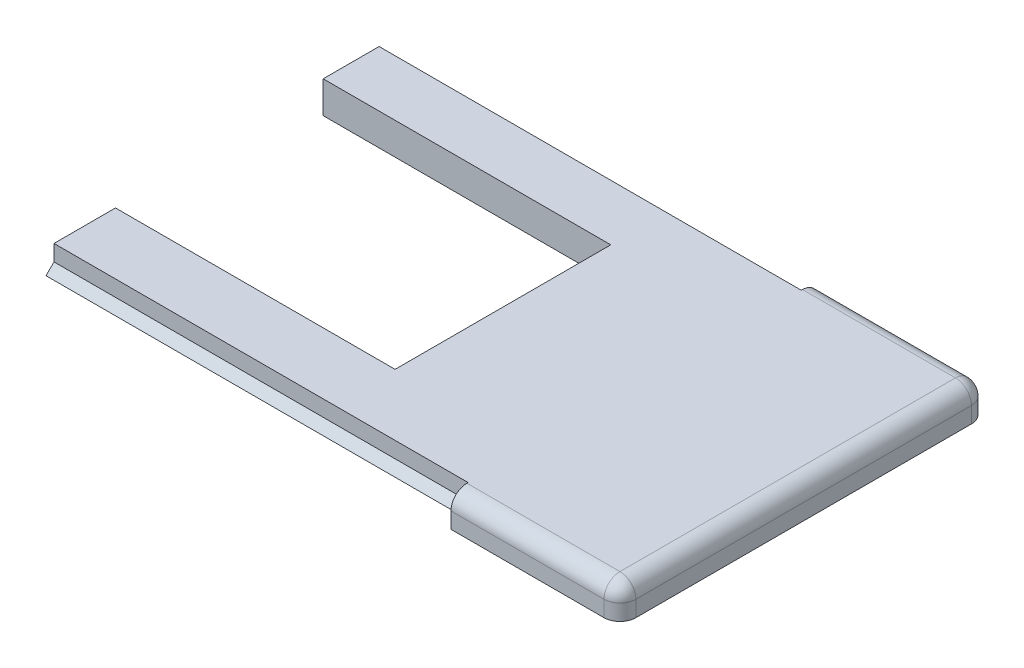
ISO-10303-21;
HEADER;
FILE_DESCRIPTION(('STEP AP214'),'2;1');
FILE_NAME('part.step','',(''),(''),'','','');
FILE_SCHEMA(('AUTOMOTIVE_DESIGN { 1 0 10303 214 1 1 1 1 }'));
ENDSEC;
DATA;
#1=APPLICATION_CONTEXT('core data for automotive mechanical design processes');
#2=APPLICATION_PROTOCOL_DEFINITION('international standard','automotive_design',2000,#1);
#3=PRODUCT_CONTEXT('',#1,'mechanical');
#4=PRODUCT('Part','Part','',(#3));
#5=PRODUCT_RELATED_PRODUCT_CATEGORY('part','',(#4));
#6=PRODUCT_DEFINITION_FORMATION('','',#4);
#7=PRODUCT_DEFINITION_CONTEXT('part definition',#1,'design');
#8=PRODUCT_DEFINITION('design','',#6,#7);
#9=PRODUCT_DEFINITION_SHAPE('','',#8);
#10=(LENGTH_UNIT() NAMED_UNIT(*) SI_UNIT(.MILLI.,.METRE.));
#11=(NAMED_UNIT(*) PLANE_ANGLE_UNIT() SI_UNIT($,.RADIAN.));
#12=(NAMED_UNIT(*) SI_UNIT($,.STERADIAN.) SOLID_ANGLE_UNIT());
#13=UNCERTAINTY_MEASURE_WITH_UNIT(LENGTH_MEASURE(1.E-05),#10,'distance_accuracy_value','');
#14=(GEOMETRIC_REPRESENTATION_CONTEXT(3) GLOBAL_UNCERTAINTY_ASSIGNED_CONTEXT((#13)) GLOBAL_UNIT_ASSIGNED_CONTEXT((#10,
#11,#12)) REPRESENTATION_CONTEXT('',''));
#15=CARTESIAN_POINT('',(0.,0.,0.));
#16=DIRECTION('',(0.,0.,1.));
#17=DIRECTION('',(1.,0.,0.));
#18=AXIS2_PLACEMENT_3D('',#15,#16,#17);
#19=CARTESIAN_POINT('',(0.,4.,0.));
#20=DIRECTION('',(0.,1.,0.));
#21=DIRECTION('',(0.,0.,1.));
#22=AXIS2_PLACEMENT_3D('',#19,#20,#21);
#23=PLANE('',#22);
#24=DIRECTION('',(0.,0.,1.));
#25=VECTOR('',#24,1.);
#26=CARTESIAN_POINT('',(36.15,4.,0.));
#27=LINE('',#26,#25);
#28=CARTESIAN_POINT('',(36.15,4.,21.));
#29=VERTEX_POINT('',#28);
#30=CARTESIAN_POINT('',(36.15,4.,-21.));
#31=VERTEX_POINT('',#30);
#32=EDGE_CURVE('E58',#29,#31,#27,.F.);
#33=ORIENTED_EDGE('',*,*,#32,.T.);
#34=DIRECTION('',(1.,0.,0.));
#35=VECTOR('',#34,1.);
#36=CARTESIAN_POINT('',(0.,4.,-21.));
#37=LINE('',#36,#35);
#38=CARTESIAN_POINT('',(17.,4.,-21.));
#39=VERTEX_POINT('',#38);
#40=EDGE_CURVE('E367',#31,#39,#37,.F.);
#41=ORIENTED_EDGE('',*,*,#40,.T.);
#42=DIRECTION('',(0.,0.,1.));
#43=VECTOR('',#42,1.);
#44=CARTESIAN_POINT('',(17.,4.,0.));
#45=LINE('',#44,#43);
#46=CARTESIAN_POINT('',(17.,4.,-20.85));
#47=VERTEX_POINT('',#46);
#48=EDGE_CURVE('E314',#39,#47,#45,.T.);
#49=ORIENTED_EDGE('',*,*,#48,.T.);
#50=DIRECTION('',(1.,0.,0.));
#51=VECTOR('',#50,1.);
#52=CARTESIAN_POINT('',(0.,4.,-20.85));
#53=LINE('',#52,#51);
#54=CARTESIAN_POINT('',(-35.85,4.,-20.85));
#55=VERTEX_POINT('',#54);
#56=EDGE_CURVE('E315',#55,#47,#53,.T.);
#57=ORIENTED_EDGE('',*,*,#56,.F.);
#58=DIRECTION('',(0.,0.,-1.));
#59=VECTOR('',#58,1.);
#60=CARTESIAN_POINT('',(-35.85,4.,-13.85));
#61=LINE('',#60,#59);
#62=CARTESIAN_POINT('',(-35.85,4.,-13.85));
#63=VERTEX_POINT('',#62);
#64=EDGE_CURVE('E230',#63,#55,#61,.T.);
#65=ORIENTED_EDGE('',*,*,#64,.F.);
#66=DIRECTION('',(1.,0.,0.));
#67=VECTOR('',#66,1.);
#68=CARTESIAN_POINT('',(0.,4.,-13.85));
#69=LINE('',#68,#67);
#70=CARTESIAN_POINT('',(0.149999999999997,4.,-13.85));
#71=VERTEX_POINT('',#70);
#72=EDGE_CURVE('E263',#63,#71,#69,.T.);
#73=ORIENTED_EDGE('',*,*,#72,.T.);
#74=DIRECTION('',(0.,0.,1.));
#75=VECTOR('',#74,1.);
#76=CARTESIAN_POINT('',(0.149999999999997,4.,0.));
#77=LINE('',#76,#75);
#78=CARTESIAN_POINT('',(0.149999999999997,4.,13.15));
#79=VERTEX_POINT('',#78);
#80=EDGE_CURVE('E276',#71,#79,#77,.T.);
#81=ORIENTED_EDGE('',*,*,#80,.T.);
#82=DIRECTION('',(1.,0.,0.));
#83=VECTOR('',#82,1.);
#84=CARTESIAN_POINT('',(0.,4.,13.15));
#85=LINE('',#84,#83);
#86=CARTESIAN_POINT('',(-34.85,4.,13.15));
#87=VERTEX_POINT('',#86);
#88=EDGE_CURVE('E273',#87,#79,#85,.T.);
#89=ORIENTED_EDGE('',*,*,#88,.F.);
#90=DIRECTION('',(0.,0.,-1.));
#91=VECTOR('',#90,1.);
#92=CARTESIAN_POINT('',(-34.85,4.,0.));
#93=LINE('',#92,#91);
#94=CARTESIAN_POINT('',(-34.85,4.,20.85));
#95=VERTEX_POINT('',#94);
#96=EDGE_CURVE('E318',#95,#87,#93,.T.);
#97=ORIENTED_EDGE('',*,*,#96,.F.);
#98=DIRECTION('',(1.,0.,0.));
#99=VECTOR('',#98,1.);
#100=CARTESIAN_POINT('',(0.,4.,20.85));
#101=LINE('',#100,#99);
#102=CARTESIAN_POINT('',(17.,4.,20.85));
#103=VERTEX_POINT('',#102);
#104=EDGE_CURVE('E309',#95,#103,#101,.T.);
#105=ORIENTED_EDGE('',*,*,#104,.T.);
#106=CARTESIAN_POINT('',(17.,4.,21.));
#107=VERTEX_POINT('',#106);
#108=EDGE_CURVE('E312',#103,#107,#45,.T.);
#109=ORIENTED_EDGE('',*,*,#108,.T.);
#110=DIRECTION('',(1.,0.,0.));
#111=VECTOR('',#110,1.);
#112=CARTESIAN_POINT('',(38.15,4.,21.));
#113=LINE('',#112,#111);
#114=EDGE_CURVE('E63',#107,#29,#113,.T.);
#115=ORIENTED_EDGE('',*,*,#114,.T.);
#116=EDGE_LOOP('',(#33,#41,#49,#57,#65,#73,#81,#89,#97,#105,#109,#115));
#117=FACE_BOUND('',#116,.T.);
#118=ADVANCED_FACE('F41',(#117),#23,.T.);
#119=CARTESIAN_POINT('',(0.,0.,0.));
#120=DIRECTION('',(0.,1.,0.));
#121=DIRECTION('',(0.,0.,1.));
#122=AXIS2_PLACEMENT_3D('',#119,#120,#121);
#123=PLANE('',#122);
#124=DIRECTION('',(0.,0.,-1.));
#125=VECTOR('',#124,1.);
#126=CARTESIAN_POINT('',(35.9,0.,5.));
#127=LINE('',#126,#125);
#128=CARTESIAN_POINT('',(35.9,0.,5.));
#129=VERTEX_POINT('',#128);
#130=CARTESIAN_POINT('',(35.9,0.,-5.));
#131=VERTEX_POINT('',#130);
#132=EDGE_CURVE('E255',#129,#131,#127,.T.);
#133=ORIENTED_EDGE('',*,*,#132,.F.);
#134=DIRECTION('',(-1.,0.,0.));
#135=VECTOR('',#134,1.);
#136=CARTESIAN_POINT('',(0.,0.,5.));
#137=LINE('',#136,#135);
#138=CARTESIAN_POINT('',(37.4,0.,5.));
#139=VERTEX_POINT('',#138);
#140=EDGE_CURVE('E240',#139,#129,#137,.T.);
#141=ORIENTED_EDGE('',*,*,#140,.F.);
#142=DIRECTION('',(0.,0.,-1.));
#143=VECTOR('',#142,1.);
#144=CARTESIAN_POINT('',(37.4,0.,5.));
#145=LINE('',#144,#143);
#146=CARTESIAN_POINT('',(37.4,0.,-5.));
#147=VERTEX_POINT('',#146);
#148=EDGE_CURVE('E258',#139,#147,#145,.T.);
#149=ORIENTED_EDGE('',*,*,#148,.T.);
#150=DIRECTION('',(-1.,0.,0.));
#151=VECTOR('',#150,1.);
#152=CARTESIAN_POINT('',(0.,0.,-5.));
#153=LINE('',#152,#151);
#154=EDGE_CURVE('E250',#147,#131,#153,.T.);
#155=ORIENTED_EDGE('',*,*,#154,.T.);
#156=EDGE_LOOP('',(#133,#141,#149,#155));
#157=FACE_BOUND('',#156,.T.);
#158=DIRECTION('',(0.,0.,-1.));
#159=VECTOR('',#158,1.);
#160=CARTESIAN_POINT('',(38.15,0.,23.));
#161=LINE('',#160,#159);
#162=CARTESIAN_POINT('',(38.15,0.,21.));
#163=VERTEX_POINT('',#162);
#164=CARTESIAN_POINT('',(38.15,0.,-21.));
#165=VERTEX_POINT('',#164);
#166=EDGE_CURVE('E260',#163,#165,#161,.T.);
#167=ORIENTED_EDGE('',*,*,#166,.F.);
#168=CARTESIAN_POINT('',(36.15,0.,21.));
#169=DIRECTION('',(0.,1.,0.));
#170=DIRECTION('',(0.,0.,1.));
#171=AXIS2_PLACEMENT_3D('',#168,#169,#170);
#172=CIRCLE('',#171,2.);
#173=CARTESIAN_POINT('',(36.15,0.,23.));
#174=VERTEX_POINT('',#173);
#175=EDGE_CURVE('E355',#163,#174,#172,.F.);
#176=ORIENTED_EDGE('',*,*,#175,.T.);
#177=DIRECTION('',(1.,0.,0.));
#178=VECTOR('',#177,1.);
#179=CARTESIAN_POINT('',(0.,0.,23.));
#180=LINE('',#179,#178);
#181=CARTESIAN_POINT('',(17.,0.,23.));
#182=VERTEX_POINT('',#181);
#183=EDGE_CURVE('E327',#182,#174,#180,.T.);
#184=ORIENTED_EDGE('',*,*,#183,.F.);
#185=DIRECTION('',(0.,0.,1.));
#186=VECTOR('',#185,1.);
#187=CARTESIAN_POINT('',(17.,0.,0.));
#188=LINE('',#187,#186);
#189=CARTESIAN_POINT('',(17.,0.,20.85));
#190=VERTEX_POINT('',#189);
#191=EDGE_CURVE('E324',#190,#182,#188,.T.);
#192=ORIENTED_EDGE('',*,*,#191,.F.);
#193=DIRECTION('',(1.,0.,0.));
#194=VECTOR('',#193,1.);
#195=CARTESIAN_POINT('',(0.,0.,20.85));
#196=LINE('',#195,#194);
#197=CARTESIAN_POINT('',(-34.85,0.,20.85));
#198=VERTEX_POINT('',#197);
#199=EDGE_CURVE('E302',#198,#190,#196,.T.);
#200=ORIENTED_EDGE('',*,*,#199,.F.);
#201=DIRECTION('',(0.,0.,-1.));
#202=VECTOR('',#201,1.);
#203=CARTESIAN_POINT('',(-34.85,0.,0.));
#204=LINE('',#203,#202);
#205=CARTESIAN_POINT('',(-34.85,0.,13.15));
#206=VERTEX_POINT('',#205);
#207=EDGE_CURVE('E206',#198,#206,#204,.T.);
#208=ORIENTED_EDGE('',*,*,#207,.T.);
#209=DIRECTION('',(-1.,0.,0.));
#210=VECTOR('',#209,1.);
#211=CARTESIAN_POINT('',(0.,0.,13.15));
#212=LINE('',#211,#210);
#213=CARTESIAN_POINT('',(0.149999999999997,0.,13.15));
#214=VERTEX_POINT('',#213);
#215=EDGE_CURVE('E264',#214,#206,#212,.T.);
#216=ORIENTED_EDGE('',*,*,#215,.F.);
#217=DIRECTION('',(0.,0.,-1.));
#218=VECTOR('',#217,1.);
#219=CARTESIAN_POINT('',(0.149999999999997,0.,0.));
#220=LINE('',#219,#218);
#221=CARTESIAN_POINT('',(0.149999999999997,0.,-13.85));
#222=VERTEX_POINT('',#221);
#223=EDGE_CURVE('E266',#214,#222,#220,.T.);
#224=ORIENTED_EDGE('',*,*,#223,.T.);
#225=DIRECTION('',(-1.,0.,0.));
#226=VECTOR('',#225,1.);
#227=CARTESIAN_POINT('',(0.,0.,-13.85));
#228=LINE('',#227,#226);
#229=CARTESIAN_POINT('',(-35.85,0.,-13.85));
#230=VERTEX_POINT('',#229);
#231=EDGE_CURVE('E214',#222,#230,#228,.T.);
#232=ORIENTED_EDGE('',*,*,#231,.T.);
#233=DIRECTION('',(0.,0.,1.));
#234=VECTOR('',#233,1.);
#235=CARTESIAN_POINT('',(-35.85,0.,-20.85));
#236=LINE('',#235,#234);
#237=CARTESIAN_POINT('',(-35.85,0.,-20.85));
#238=VERTEX_POINT('',#237);
#239=EDGE_CURVE('E210',#238,#230,#236,.T.);
#240=ORIENTED_EDGE('',*,*,#239,.F.);
#241=DIRECTION('',(1.,0.,0.));
#242=VECTOR('',#241,1.);
#243=CARTESIAN_POINT('',(0.,0.,-20.85));
#244=LINE('',#243,#242);
#245=CARTESIAN_POINT('',(17.,0.,-20.85));
#246=VERTEX_POINT('',#245);
#247=EDGE_CURVE('E196',#238,#246,#244,.T.);
#248=ORIENTED_EDGE('',*,*,#247,.T.);
#249=CARTESIAN_POINT('',(17.,0.,-23.));
#250=VERTEX_POINT('',#249);
#251=EDGE_CURVE('E207',#250,#246,#188,.T.);
#252=ORIENTED_EDGE('',*,*,#251,.F.);
#253=DIRECTION('',(1.,0.,0.));
#254=VECTOR('',#253,1.);
#255=CARTESIAN_POINT('',(0.,0.,-23.));
#256=LINE('',#255,#254);
#257=CARTESIAN_POINT('',(36.15,0.,-23.));
#258=VERTEX_POINT('',#257);
#259=EDGE_CURVE('E330',#250,#258,#256,.T.);
#260=ORIENTED_EDGE('',*,*,#259,.T.);
#261=CARTESIAN_POINT('',(36.15,0.,-21.));
#262=DIRECTION('',(0.,1.,0.));
#263=DIRECTION('',(0.,0.,1.));
#264=AXIS2_PLACEMENT_3D('',#261,#262,#263);
#265=CIRCLE('',#264,2.);
#266=EDGE_CURVE('E353',#258,#165,#265,.F.);
#267=ORIENTED_EDGE('',*,*,#266,.T.);
#268=EDGE_LOOP('',(#167,#176,#184,#192,#200,#208,#216,#224,#232,#240,#248,#252,#260,#267));
#269=FACE_BOUND('',#268,.T.);
#270=ADVANCED_FACE('F212',(#157,#269),#123,.F.);
#271=CARTESIAN_POINT('',(0.,4.,20.85));
#272=DIRECTION('',(0.,0.,-1.));
#273=DIRECTION('',(-1.,0.,0.));
#274=AXIS2_PLACEMENT_3D('',#271,#272,#273);
#275=PLANE('',#274);
#276=DIRECTION('',(1.,0.,0.));
#277=VECTOR('',#276,1.);
#278=CARTESIAN_POINT('',(-37.0860679774998,2.00000000000003,20.85));
#279=LINE('',#278,#277);
#280=CARTESIAN_POINT('',(-34.85,2.00000000000003,20.85));
#281=VERTEX_POINT('',#280);
#282=CARTESIAN_POINT('',(17.,2.00000000000003,20.85));
#283=VERTEX_POINT('',#282);
#284=EDGE_CURVE('E270',#281,#283,#279,.T.);
#285=ORIENTED_EDGE('',*,*,#284,.T.);
#286=DIRECTION('',(0.,-1.,0.));
#287=VECTOR('',#286,1.);
#288=CARTESIAN_POINT('',(17.,4.,20.85));
#289=LINE('',#288,#287);
#290=EDGE_CURVE('E343',#103,#283,#289,.T.);
#291=ORIENTED_EDGE('',*,*,#290,.F.);
#292=ORIENTED_EDGE('',*,*,#104,.F.);
#293=DIRECTION('',(0.,-1.,0.));
#294=VECTOR('',#293,1.);
#295=CARTESIAN_POINT('',(-34.85,4.,20.85));
#296=LINE('',#295,#294);
#297=EDGE_CURVE('E321',#95,#281,#296,.T.);
#298=ORIENTED_EDGE('',*,*,#297,.T.);
#299=EDGE_LOOP('',(#285,#291,#292,#298));
#300=FACE_BOUND('',#299,.T.);
#301=ADVANCED_FACE('F436',(#300),#275,.F.);
#302=CARTESIAN_POINT('',(17.,4.,0.));
#303=DIRECTION('',(1.,0.,0.));
#304=DIRECTION('',(0.,0.,-1.));
#305=AXIS2_PLACEMENT_3D('',#302,#303,#304);
#306=PLANE('',#305);
#307=DIRECTION('',(0.,-1.,0.));
#308=VECTOR('',#307,1.);
#309=CARTESIAN_POINT('',(17.,4.,23.));
#310=LINE('',#309,#308);
#311=CARTESIAN_POINT('',(17.,2.,23.));
#312=VERTEX_POINT('',#311);
#313=EDGE_CURVE('E341',#312,#182,#310,.T.);
#314=ORIENTED_EDGE('',*,*,#313,.F.);
#315=CARTESIAN_POINT('',(17.,2.,21.));
#316=DIRECTION('',(1.,0.,0.));
#317=DIRECTION('',(0.,0.,-1.));
#318=AXIS2_PLACEMENT_3D('',#315,#316,#317);
#319=CIRCLE('',#318,2.);
#320=EDGE_CURVE('E11',#312,#107,#319,.F.);
#321=ORIENTED_EDGE('',*,*,#320,.T.);
#322=ORIENTED_EDGE('',*,*,#108,.F.);
#323=ORIENTED_EDGE('',*,*,#290,.T.);
#324=DIRECTION('',(0.,0.707106781186551,-0.707106781186544));
#325=VECTOR('',#324,1.);
#326=CARTESIAN_POINT('',(17.,2.00000000000003,20.85));
#327=LINE('',#326,#325);
#328=CARTESIAN_POINT('',(17.,1.00000000000002,21.85));
#329=VERTEX_POINT('',#328);
#330=EDGE_CURVE('E284',#329,#283,#327,.T.);
#331=ORIENTED_EDGE('',*,*,#330,.F.);
#332=DIRECTION('',(0.,0.707106781186551,0.707106781186544));
#333=VECTOR('',#332,1.);
#334=CARTESIAN_POINT('',(17.,1.00000000000002,21.85));
#335=LINE('',#334,#333);
#336=EDGE_CURVE('E289',#190,#329,#335,.T.);
#337=ORIENTED_EDGE('',*,*,#336,.F.);
#338=ORIENTED_EDGE('',*,*,#191,.T.);
#339=EDGE_LOOP('',(#314,#321,#322,#323,#331,#337,#338));
#340=FACE_BOUND('',#339,.T.);
#341=ADVANCED_FACE('F439',(#340),#306,.F.);
#342=ORIENTED_EDGE('',*,*,#48,.F.);
#343=CARTESIAN_POINT('',(17.,2.,-21.));
#344=DIRECTION('',(1.,0.,0.));
#345=DIRECTION('',(0.,0.,-1.));
#346=AXIS2_PLACEMENT_3D('',#343,#344,#345);
#347=CIRCLE('',#346,2.);
#348=CARTESIAN_POINT('',(17.,2.,-23.));
#349=VERTEX_POINT('',#348);
#350=EDGE_CURVE('E50',#39,#349,#347,.F.);
#351=ORIENTED_EDGE('',*,*,#350,.T.);
#352=DIRECTION('',(0.,-1.,0.));
#353=VECTOR('',#352,1.);
#354=CARTESIAN_POINT('',(17.,4.,-23.));
#355=LINE('',#354,#353);
#356=EDGE_CURVE('E339',#349,#250,#355,.T.);
#357=ORIENTED_EDGE('',*,*,#356,.T.);
#358=ORIENTED_EDGE('',*,*,#251,.T.);
#359=DIRECTION('',(0.,-0.707106781186552,0.707106781186543));
#360=VECTOR('',#359,1.);
#361=CARTESIAN_POINT('',(17.,1.00000000000003,-21.85));
#362=LINE('',#361,#360);
#363=CARTESIAN_POINT('',(17.,1.00000000000003,-21.85));
#364=VERTEX_POINT('',#363);
#365=EDGE_CURVE('E202',#364,#246,#362,.T.);
#366=ORIENTED_EDGE('',*,*,#365,.F.);
#367=DIRECTION('',(0.,-0.707106781186551,-0.707106781186544));
#368=VECTOR('',#367,1.);
#369=CARTESIAN_POINT('',(17.,2.00000000000004,-20.85));
#370=LINE('',#369,#368);
#371=CARTESIAN_POINT('',(17.,2.00000000000004,-20.85));
#372=VERTEX_POINT('',#371);
#373=EDGE_CURVE('E304',#372,#364,#370,.T.);
#374=ORIENTED_EDGE('',*,*,#373,.F.);
#375=DIRECTION('',(0.,-1.,0.));
#376=VECTOR('',#375,1.);
#377=CARTESIAN_POINT('',(17.,4.,-20.85));
#378=LINE('',#377,#376);
#379=EDGE_CURVE('E336',#47,#372,#378,.T.);
#380=ORIENTED_EDGE('',*,*,#379,.F.);
#381=EDGE_LOOP('',(#342,#351,#357,#358,#366,#374,#380));
#382=FACE_BOUND('',#381,.T.);
#383=ADVANCED_FACE('F401',(#382),#306,.F.);
#384=CARTESIAN_POINT('',(0.,4.,-20.85));
#385=DIRECTION('',(0.,0.,-1.));
#386=DIRECTION('',(-1.,0.,0.));
#387=AXIS2_PLACEMENT_3D('',#384,#385,#386);
#388=PLANE('',#387);
#389=ORIENTED_EDGE('',*,*,#379,.T.);
#390=DIRECTION('',(1.,0.,0.));
#391=VECTOR('',#390,1.);
#392=CARTESIAN_POINT('',(-37.0860679774998,2.00000000000004,-20.85));
#393=LINE('',#392,#391);
#394=CARTESIAN_POINT('',(-35.85,2.00000000000004,-20.85));
#395=VERTEX_POINT('',#394);
#396=EDGE_CURVE('E295',#395,#372,#393,.T.);
#397=ORIENTED_EDGE('',*,*,#396,.F.);
#398=DIRECTION('',(0.,-1.,0.));
#399=VECTOR('',#398,1.);
#400=CARTESIAN_POINT('',(-35.85,4.,-20.85));
#401=LINE('',#400,#399);
#402=EDGE_CURVE('E233',#55,#395,#401,.T.);
#403=ORIENTED_EDGE('',*,*,#402,.F.);
#404=ORIENTED_EDGE('',*,*,#56,.T.);
#405=EDGE_LOOP('',(#389,#397,#403,#404));
#406=FACE_BOUND('',#405,.T.);
#407=ADVANCED_FACE('F406',(#406),#388,.T.);
#408=CARTESIAN_POINT('',(0.,4.,23.));
#409=DIRECTION('',(0.,0.,-1.));
#410=DIRECTION('',(-1.,0.,0.));
#411=AXIS2_PLACEMENT_3D('',#408,#409,#410);
#412=PLANE('',#411);
#413=ORIENTED_EDGE('',*,*,#183,.T.);
#414=DIRECTION('',(0.,-1.,0.));
#415=VECTOR('',#414,1.);
#416=CARTESIAN_POINT('',(36.15,4.,23.));
#417=LINE('',#416,#415);
#418=CARTESIAN_POINT('',(36.15,2.,23.));
#419=VERTEX_POINT('',#418);
#420=EDGE_CURVE('E359',#174,#419,#417,.F.);
#421=ORIENTED_EDGE('',*,*,#420,.T.);
#422=DIRECTION('',(1.,0.,0.));
#423=VECTOR('',#422,1.);
#424=CARTESIAN_POINT('',(17.,2.,23.));
#425=LINE('',#424,#423);
#426=EDGE_CURVE('E357',#419,#312,#425,.F.);
#427=ORIENTED_EDGE('',*,*,#426,.T.);
#428=ORIENTED_EDGE('',*,*,#313,.T.);
#429=EDGE_LOOP('',(#413,#421,#427,#428));
#430=FACE_BOUND('',#429,.T.);
#431=ADVANCED_FACE('F456',(#430),#412,.F.);
#432=CARTESIAN_POINT('',(0.,4.,-23.));
#433=DIRECTION('',(0.,0.,-1.));
#434=DIRECTION('',(-1.,0.,0.));
#435=AXIS2_PLACEMENT_3D('',#432,#433,#434);
#436=PLANE('',#435);
#437=DIRECTION('',(1.,0.,0.));
#438=VECTOR('',#437,1.);
#439=CARTESIAN_POINT('',(0.,2.,-23.));
#440=LINE('',#439,#438);
#441=CARTESIAN_POINT('',(36.15,2.,-23.));
#442=VERTEX_POINT('',#441);
#443=EDGE_CURVE('E361',#349,#442,#440,.T.);
#444=ORIENTED_EDGE('',*,*,#443,.T.);
#445=DIRECTION('',(0.,1.,0.));
#446=VECTOR('',#445,1.);
#447=CARTESIAN_POINT('',(36.15,4.,-23.));
#448=LINE('',#447,#446);
#449=EDGE_CURVE('E363',#442,#258,#448,.F.);
#450=ORIENTED_EDGE('',*,*,#449,.T.);
#451=ORIENTED_EDGE('',*,*,#259,.F.);
#452=ORIENTED_EDGE('',*,*,#356,.F.);
#453=EDGE_LOOP('',(#444,#450,#451,#452));
#454=FACE_BOUND('',#453,.T.);
#455=ADVANCED_FACE('F454',(#454),#436,.T.);
#456=CARTESIAN_POINT('',(-34.85,4.,0.));
#457=DIRECTION('',(-1.,0.,0.));
#458=DIRECTION('',(0.,0.,1.));
#459=AXIS2_PLACEMENT_3D('',#456,#457,#458);
#460=PLANE('',#459);
#461=DIRECTION('',(0.,1.,0.));
#462=VECTOR('',#461,1.);
#463=CARTESIAN_POINT('',(-34.85,-44.2040722106007,13.15));
#464=LINE('',#463,#462);
#465=EDGE_CURVE('E279',#206,#87,#464,.T.);
#466=ORIENTED_EDGE('',*,*,#465,.F.);
#467=ORIENTED_EDGE('',*,*,#207,.F.);
#468=DIRECTION('',(0.,0.707106781186551,0.707106781186544));
#469=VECTOR('',#468,1.);
#470=CARTESIAN_POINT('',(-34.85,1.00000000000002,21.85));
#471=LINE('',#470,#469);
#472=CARTESIAN_POINT('',(-34.85,1.00000000000002,21.85));
#473=VERTEX_POINT('',#472);
#474=EDGE_CURVE('E292',#198,#473,#471,.T.);
#475=ORIENTED_EDGE('',*,*,#474,.T.);
#476=DIRECTION('',(0.,0.707106781186551,-0.707106781186544));
#477=VECTOR('',#476,1.);
#478=CARTESIAN_POINT('',(-34.85,2.00000000000003,20.85));
#479=LINE('',#478,#477);
#480=EDGE_CURVE('E287',#473,#281,#479,.T.);
#481=ORIENTED_EDGE('',*,*,#480,.T.);
#482=ORIENTED_EDGE('',*,*,#297,.F.);
#483=ORIENTED_EDGE('',*,*,#96,.T.);
#484=EDGE_LOOP('',(#466,#467,#475,#481,#482,#483));
#485=FACE_BOUND('',#484,.T.);
#486=ADVANCED_FACE('F423',(#485),#460,.T.);
#487=CARTESIAN_POINT('',(-37.0860679774998,2.00000000000004,-20.85));
#488=DIRECTION('',(0.,-0.707106781186544,0.707106781186551));
#489=DIRECTION('',(0.,-0.707106781186551,-0.707106781186544));
#490=AXIS2_PLACEMENT_3D('',#487,#488,#489);
#491=PLANE('',#490);
#492=DIRECTION('',(1.,0.,0.));
#493=VECTOR('',#492,1.);
#494=CARTESIAN_POINT('',(-37.0860679774998,1.00000000000003,-21.85));
#495=LINE('',#494,#493);
#496=CARTESIAN_POINT('',(-35.85,1.00000000000003,-21.85));
#497=VERTEX_POINT('',#496);
#498=EDGE_CURVE('E303',#497,#364,#495,.T.);
#499=ORIENTED_EDGE('',*,*,#498,.F.);
#500=DIRECTION('',(0.,-0.707106781186551,-0.707106781186544));
#501=VECTOR('',#500,1.);
#502=CARTESIAN_POINT('',(-35.85,2.00000000000004,-20.85));
#503=LINE('',#502,#501);
#504=EDGE_CURVE('E224',#395,#497,#503,.T.);
#505=ORIENTED_EDGE('',*,*,#504,.F.);
#506=ORIENTED_EDGE('',*,*,#396,.T.);
#507=ORIENTED_EDGE('',*,*,#373,.T.);
#508=EDGE_LOOP('',(#499,#505,#506,#507));
#509=FACE_BOUND('',#508,.T.);
#510=ADVANCED_FACE('F463',(#509),#491,.F.);
#511=CARTESIAN_POINT('',(-37.0860679774998,1.00000000000003,-21.85));
#512=DIRECTION('',(0.,0.707106781186543,0.707106781186552));
#513=DIRECTION('',(0.,-0.707106781186552,0.707106781186543));
#514=AXIS2_PLACEMENT_3D('',#511,#512,#513);
#515=PLANE('',#514);
#516=ORIENTED_EDGE('',*,*,#247,.F.);
#517=DIRECTION('',(0.,-0.707106781186552,0.707106781186543));
#518=VECTOR('',#517,1.);
#519=CARTESIAN_POINT('',(-35.85,1.00000000000003,-21.85));
#520=LINE('',#519,#518);
#521=EDGE_CURVE('E200',#497,#238,#520,.T.);
#522=ORIENTED_EDGE('',*,*,#521,.F.);
#523=ORIENTED_EDGE('',*,*,#498,.T.);
#524=ORIENTED_EDGE('',*,*,#365,.T.);
#525=EDGE_LOOP('',(#516,#522,#523,#524));
#526=FACE_BOUND('',#525,.T.);
#527=ADVANCED_FACE('F198',(#526),#515,.F.);
#528=CARTESIAN_POINT('',(-37.0860679774998,1.00000000000002,21.85));
#529=DIRECTION('',(0.,0.707106781186544,-0.707106781186551));
#530=DIRECTION('',(0.,0.707106781186551,0.707106781186544));
#531=AXIS2_PLACEMENT_3D('',#528,#529,#530);
#532=PLANE('',#531);
#533=ORIENTED_EDGE('',*,*,#474,.F.);
#534=ORIENTED_EDGE('',*,*,#199,.T.);
#535=ORIENTED_EDGE('',*,*,#336,.T.);
#536=DIRECTION('',(1.,0.,0.));
#537=VECTOR('',#536,1.);
#538=CARTESIAN_POINT('',(-37.0860679774998,1.00000000000002,21.85));
#539=LINE('',#538,#537);
#540=EDGE_CURVE('E288',#473,#329,#539,.T.);
#541=ORIENTED_EDGE('',*,*,#540,.F.);
#542=EDGE_LOOP('',(#533,#534,#535,#541));
#543=FACE_BOUND('',#542,.T.);
#544=ADVANCED_FACE('F428',(#543),#532,.F.);
#545=CARTESIAN_POINT('',(-37.0860679774998,2.00000000000003,20.85));
#546=DIRECTION('',(0.,-0.707106781186544,-0.707106781186551));
#547=DIRECTION('',(0.,0.707106781186551,-0.707106781186544));
#548=AXIS2_PLACEMENT_3D('',#545,#546,#547);
#549=PLANE('',#548);
#550=ORIENTED_EDGE('',*,*,#480,.F.);
#551=ORIENTED_EDGE('',*,*,#540,.T.);
#552=ORIENTED_EDGE('',*,*,#330,.T.);
#553=ORIENTED_EDGE('',*,*,#284,.F.);
#554=EDGE_LOOP('',(#550,#551,#552,#553));
#555=FACE_BOUND('',#554,.T.);
#556=ADVANCED_FACE('F433',(#555),#549,.F.);
#557=CARTESIAN_POINT('',(0.,-44.2040722106007,-13.85));
#558=DIRECTION('',(0.,0.,1.));
#559=DIRECTION('',(1.,0.,0.));
#560=AXIS2_PLACEMENT_3D('',#557,#558,#559);
#561=PLANE('',#560);
#562=DIRECTION('',(0.,1.,0.));
#563=VECTOR('',#562,1.);
#564=CARTESIAN_POINT('',(0.149999999999997,-44.2040722106007,-13.85));
#565=LINE('',#564,#563);
#566=EDGE_CURVE('E267',#222,#71,#565,.T.);
#567=ORIENTED_EDGE('',*,*,#566,.T.);
#568=ORIENTED_EDGE('',*,*,#72,.F.);
#569=DIRECTION('',(0.,1.,0.));
#570=VECTOR('',#569,1.);
#571=CARTESIAN_POINT('',(-35.85,0.,-13.85));
#572=LINE('',#571,#570);
#573=EDGE_CURVE('E218',#230,#63,#572,.T.);
#574=ORIENTED_EDGE('',*,*,#573,.F.);
#575=ORIENTED_EDGE('',*,*,#231,.F.);
#576=EDGE_LOOP('',(#567,#568,#574,#575));
#577=FACE_BOUND('',#576,.T.);
#578=ADVANCED_FACE('F409',(#577),#561,.T.);
#579=CARTESIAN_POINT('',(0.149999999999997,-44.2040722106007,0.));
#580=DIRECTION('',(-1.,0.,0.));
#581=DIRECTION('',(0.,0.,1.));
#582=AXIS2_PLACEMENT_3D('',#579,#580,#581);
#583=PLANE('',#582);
#584=DIRECTION('',(0.,1.,0.));
#585=VECTOR('',#584,1.);
#586=CARTESIAN_POINT('',(0.149999999999997,-44.2040722106007,13.15));
#587=LINE('',#586,#585);
#588=EDGE_CURVE('E281',#214,#79,#587,.T.);
#589=ORIENTED_EDGE('',*,*,#588,.T.);
#590=ORIENTED_EDGE('',*,*,#80,.F.);
#591=ORIENTED_EDGE('',*,*,#566,.F.);
#592=ORIENTED_EDGE('',*,*,#223,.F.);
#593=EDGE_LOOP('',(#589,#590,#591,#592));
#594=FACE_BOUND('',#593,.T.);
#595=ADVANCED_FACE('F415',(#594),#583,.T.);
#596=CARTESIAN_POINT('',(0.,-44.2040722106007,13.15));
#597=DIRECTION('',(0.,0.,1.));
#598=DIRECTION('',(1.,0.,0.));
#599=AXIS2_PLACEMENT_3D('',#596,#597,#598);
#600=PLANE('',#599);
#601=ORIENTED_EDGE('',*,*,#215,.T.);
#602=ORIENTED_EDGE('',*,*,#465,.T.);
#603=ORIENTED_EDGE('',*,*,#88,.T.);
#604=ORIENTED_EDGE('',*,*,#588,.F.);
#605=EDGE_LOOP('',(#601,#602,#603,#604));
#606=FACE_BOUND('',#605,.T.);
#607=ADVANCED_FACE('F419',(#606),#600,.F.);
#608=CARTESIAN_POINT('',(38.15,0.,0.));
#609=DIRECTION('',(1.,0.,0.));
#610=DIRECTION('',(0.,0.,-1.));
#611=AXIS2_PLACEMENT_3D('',#608,#609,#610);
#612=PLANE('',#611);
#613=DIRECTION('',(0.,0.,1.));
#614=VECTOR('',#613,1.);
#615=CARTESIAN_POINT('',(38.15,2.,0.));
#616=LINE('',#615,#614);
#617=CARTESIAN_POINT('',(38.15,2.,-21.));
#618=VERTEX_POINT('',#617);
#619=CARTESIAN_POINT('',(38.15,2.,21.));
#620=VERTEX_POINT('',#619);
#621=EDGE_CURVE('E346',#618,#620,#616,.T.);
#622=ORIENTED_EDGE('',*,*,#621,.T.);
#623=DIRECTION('',(0.,-1.,0.));
#624=VECTOR('',#623,1.);
#625=CARTESIAN_POINT('',(38.15,0.,21.));
#626=LINE('',#625,#624);
#627=EDGE_CURVE('E350',#620,#163,#626,.T.);
#628=ORIENTED_EDGE('',*,*,#627,.T.);
#629=ORIENTED_EDGE('',*,*,#166,.T.);
#630=DIRECTION('',(0.,1.,0.));
#631=VECTOR('',#630,1.);
#632=CARTESIAN_POINT('',(38.15,0.,-21.));
#633=LINE('',#632,#631);
#634=EDGE_CURVE('E348',#165,#618,#633,.T.);
#635=ORIENTED_EDGE('',*,*,#634,.T.);
#636=EDGE_LOOP('',(#622,#628,#629,#635));
#637=FACE_BOUND('',#636,.T.);
#638=ADVANCED_FACE('F453',(#637),#612,.T.);
#639=CARTESIAN_POINT('',(18.7000000000001,-18.7,5.));
#640=DIRECTION('',(0.707106781186551,-0.707106781186545,0.));
#641=DIRECTION('',(0.707106781186545,0.707106781186551,0.));
#642=AXIS2_PLACEMENT_3D('',#639,#640,#641);
#643=PLANE('',#642);
#644=DIRECTION('',(-0.707106781186545,-0.707106781186551,0.));
#645=VECTOR('',#644,1.);
#646=CARTESIAN_POINT('',(18.7000000000001,-18.7,-5.));
#647=LINE('',#646,#645);
#648=CARTESIAN_POINT('',(36.65,-0.75,-5.));
#649=VERTEX_POINT('',#648);
#650=EDGE_CURVE('E236',#147,#649,#647,.T.);
#651=ORIENTED_EDGE('',*,*,#650,.F.);
#652=ORIENTED_EDGE('',*,*,#148,.F.);
#653=DIRECTION('',(-0.707106781186545,-0.707106781186551,0.));
#654=VECTOR('',#653,1.);
#655=CARTESIAN_POINT('',(18.7000000000001,-18.7,5.));
#656=LINE('',#655,#654);
#657=CARTESIAN_POINT('',(36.65,-0.75,5.));
#658=VERTEX_POINT('',#657);
#659=EDGE_CURVE('E237',#139,#658,#656,.T.);
#660=ORIENTED_EDGE('',*,*,#659,.T.);
#661=DIRECTION('',(0.,0.,-1.));
#662=VECTOR('',#661,1.);
#663=CARTESIAN_POINT('',(36.65,-0.75,5.));
#664=LINE('',#663,#662);
#665=EDGE_CURVE('E247',#658,#649,#664,.T.);
#666=ORIENTED_EDGE('',*,*,#665,.T.);
#667=EDGE_LOOP('',(#651,#652,#660,#666));
#668=FACE_BOUND('',#667,.T.);
#669=ADVANCED_FACE('F525',(#668),#643,.T.);
#670=CARTESIAN_POINT('',(17.95,17.95,5.));
#671=DIRECTION('',(-0.707106781186547,-0.707106781186548,0.));
#672=DIRECTION('',(0.707106781186548,-0.707106781186547,0.));
#673=AXIS2_PLACEMENT_3D('',#670,#671,#672);
#674=PLANE('',#673);
#675=DIRECTION('',(-0.707106781186548,0.707106781186547,0.));
#676=VECTOR('',#675,1.);
#677=CARTESIAN_POINT('',(17.95,17.95,-5.));
#678=LINE('',#677,#676);
#679=EDGE_CURVE('E241',#649,#131,#678,.T.);
#680=ORIENTED_EDGE('',*,*,#679,.F.);
#681=ORIENTED_EDGE('',*,*,#665,.F.);
#682=DIRECTION('',(-0.707106781186548,0.707106781186547,0.));
#683=VECTOR('',#682,1.);
#684=CARTESIAN_POINT('',(17.95,17.95,5.));
#685=LINE('',#684,#683);
#686=EDGE_CURVE('E244',#658,#129,#685,.T.);
#687=ORIENTED_EDGE('',*,*,#686,.T.);
#688=ORIENTED_EDGE('',*,*,#132,.T.);
#689=EDGE_LOOP('',(#680,#681,#687,#688));
#690=FACE_BOUND('',#689,.T.);
#691=ADVANCED_FACE('F520',(#690),#674,.T.);
#692=CARTESIAN_POINT('',(0.,0.,5.));
#693=DIRECTION('',(0.,0.,1.));
#694=DIRECTION('',(1.,0.,0.));
#695=AXIS2_PLACEMENT_3D('',#692,#693,#694);
#696=PLANE('',#695);
#697=ORIENTED_EDGE('',*,*,#659,.F.);
#698=ORIENTED_EDGE('',*,*,#140,.T.);
#699=ORIENTED_EDGE('',*,*,#686,.F.);
#700=EDGE_LOOP('',(#697,#698,#699));
#701=FACE_BOUND('',#700,.T.);
#702=ADVANCED_FACE('F515',(#701),#696,.T.);
#703=CARTESIAN_POINT('',(0.,0.,-5.));
#704=DIRECTION('',(0.,0.,1.));
#705=DIRECTION('',(1.,0.,0.));
#706=AXIS2_PLACEMENT_3D('',#703,#704,#705);
#707=PLANE('',#706);
#708=ORIENTED_EDGE('',*,*,#650,.T.);
#709=ORIENTED_EDGE('',*,*,#679,.T.);
#710=ORIENTED_EDGE('',*,*,#154,.F.);
#711=EDGE_LOOP('',(#708,#709,#710));
#712=FACE_BOUND('',#711,.T.);
#713=ADVANCED_FACE('F509',(#712),#707,.F.);
#714=CARTESIAN_POINT('',(-35.85,0.,0.));
#715=DIRECTION('',(1.,0.,0.));
#716=DIRECTION('',(0.,0.,-1.));
#717=AXIS2_PLACEMENT_3D('',#714,#715,#716);
#718=PLANE('',#717);
#719=ORIENTED_EDGE('',*,*,#521,.T.);
#720=ORIENTED_EDGE('',*,*,#239,.T.);
#721=ORIENTED_EDGE('',*,*,#573,.T.);
#722=ORIENTED_EDGE('',*,*,#64,.T.);
#723=ORIENTED_EDGE('',*,*,#402,.T.);
#724=ORIENTED_EDGE('',*,*,#504,.T.);
#725=EDGE_LOOP('',(#719,#720,#721,#722,#723,#724));
#726=FACE_BOUND('',#725,.T.);
#727=ADVANCED_FACE('F221',(#726),#718,.F.);
#728=CARTESIAN_POINT('',(0.,2.,-21.));
#729=DIRECTION('',(1.,0.,0.));
#730=DIRECTION('',(0.,0.,-1.));
#731=AXIS2_PLACEMENT_3D('',#728,#729,#730);
#732=CYLINDRICAL_SURFACE('',#731,2.);
#733=ORIENTED_EDGE('',*,*,#350,.F.);
#734=ORIENTED_EDGE('',*,*,#40,.F.);
#735=CARTESIAN_POINT('',(36.15,2.,-21.));
#736=DIRECTION('',(1.,0.,0.));
#737=DIRECTION('',(0.,0.,-1.));
#738=AXIS2_PLACEMENT_3D('',#735,#736,#737);
#739=CIRCLE('',#738,2.);
#740=EDGE_CURVE('E45',#442,#31,#739,.T.);
#741=ORIENTED_EDGE('',*,*,#740,.F.);
#742=ORIENTED_EDGE('',*,*,#443,.F.);
#743=EDGE_LOOP('',(#733,#734,#741,#742));
#744=FACE_BOUND('',#743,.T.);
#745=ADVANCED_FACE('F43',(#744),#732,.T.);
#746=CARTESIAN_POINT('',(36.15,0.,-21.));
#747=DIRECTION('',(0.,1.,0.));
#748=DIRECTION('',(0.,0.,1.));
#749=AXIS2_PLACEMENT_3D('',#746,#747,#748);
#750=CYLINDRICAL_SURFACE('',#749,2.);
#751=ORIENTED_EDGE('',*,*,#266,.F.);
#752=ORIENTED_EDGE('',*,*,#449,.F.);
#753=CARTESIAN_POINT('',(36.15,2.,-21.));
#754=DIRECTION('',(0.,1.,0.));
#755=DIRECTION('',(0.,0.,1.));
#756=AXIS2_PLACEMENT_3D('',#753,#754,#755);
#757=CIRCLE('',#756,2.);
#758=EDGE_CURVE('E227',#618,#442,#757,.T.);
#759=ORIENTED_EDGE('',*,*,#758,.F.);
#760=ORIENTED_EDGE('',*,*,#634,.F.);
#761=EDGE_LOOP('',(#751,#752,#759,#760));
#762=FACE_BOUND('',#761,.T.);
#763=ADVANCED_FACE('F392',(#762),#750,.T.);
#764=CARTESIAN_POINT('',(36.15,2.,-21.));
#765=DIRECTION('',(0.,0.,-1.));
#766=DIRECTION('',(-1.,0.,0.));
#767=AXIS2_PLACEMENT_3D('',#764,#765,#766);
#768=SPHERICAL_SURFACE('',#767,2.);
#769=ORIENTED_EDGE('',*,*,#758,.T.);
#770=ORIENTED_EDGE('',*,*,#740,.T.);
#771=CARTESIAN_POINT('',(36.15,2.,-21.));
#772=DIRECTION('',(0.,0.,-1.));
#773=DIRECTION('',(-1.,0.,0.));
#774=AXIS2_PLACEMENT_3D('',#771,#772,#773);
#775=CIRCLE('',#774,2.);
#776=EDGE_CURVE('E379',#618,#31,#775,.F.);
#777=ORIENTED_EDGE('',*,*,#776,.F.);
#778=EDGE_LOOP('',(#769,#770,#777));
#779=FACE_BOUND('',#778,.T.);
#780=ADVANCED_FACE('F385',(#779),#768,.T.);
#781=CARTESIAN_POINT('',(0.,2.,21.));
#782=DIRECTION('',(-1.,0.,0.));
#783=DIRECTION('',(0.,0.,1.));
#784=AXIS2_PLACEMENT_3D('',#781,#782,#783);
#785=CYLINDRICAL_SURFACE('',#784,2.);
#786=ORIENTED_EDGE('',*,*,#320,.F.);
#787=ORIENTED_EDGE('',*,*,#426,.F.);
#788=CARTESIAN_POINT('',(36.15,2.,21.));
#789=DIRECTION('',(1.,0.,0.));
#790=DIRECTION('',(0.,0.,-1.));
#791=AXIS2_PLACEMENT_3D('',#788,#789,#790);
#792=CIRCLE('',#791,2.);
#793=EDGE_CURVE('E376',#29,#419,#792,.T.);
#794=ORIENTED_EDGE('',*,*,#793,.F.);
#795=ORIENTED_EDGE('',*,*,#114,.F.);
#796=EDGE_LOOP('',(#786,#787,#794,#795));
#797=FACE_BOUND('',#796,.T.);
#798=ADVANCED_FACE('F443',(#797),#785,.T.);
#799=CARTESIAN_POINT('',(36.15,2.,0.));
#800=DIRECTION('',(0.,0.,1.));
#801=DIRECTION('',(1.,0.,0.));
#802=AXIS2_PLACEMENT_3D('',#799,#800,#801);
#803=CYLINDRICAL_SURFACE('',#802,2.);
#804=ORIENTED_EDGE('',*,*,#776,.T.);
#805=ORIENTED_EDGE('',*,*,#32,.F.);
#806=CARTESIAN_POINT('',(36.15,2.,21.));
#807=DIRECTION('',(0.,0.,1.));
#808=DIRECTION('',(1.,0.,0.));
#809=AXIS2_PLACEMENT_3D('',#806,#807,#808);
#810=CIRCLE('',#809,2.);
#811=EDGE_CURVE('E373',#620,#29,#810,.T.);
#812=ORIENTED_EDGE('',*,*,#811,.F.);
#813=ORIENTED_EDGE('',*,*,#621,.F.);
#814=EDGE_LOOP('',(#804,#805,#812,#813));
#815=FACE_BOUND('',#814,.T.);
#816=ADVANCED_FACE('F451',(#815),#803,.T.);
#817=CARTESIAN_POINT('',(36.15,2.,21.));
#818=DIRECTION('',(0.,1.,0.));
#819=DIRECTION('',(-1.,0.,0.));
#820=AXIS2_PLACEMENT_3D('',#817,#818,#819);
#821=SPHERICAL_SURFACE('',#820,2.);
#822=ORIENTED_EDGE('',*,*,#811,.T.);
#823=ORIENTED_EDGE('',*,*,#793,.T.);
#824=CARTESIAN_POINT('',(36.15,2.,21.));
#825=DIRECTION('',(0.,1.,0.));
#826=DIRECTION('',(0.,0.,1.));
#827=AXIS2_PLACEMENT_3D('',#824,#825,#826);
#828=CIRCLE('',#827,2.);
#829=EDGE_CURVE('E370',#620,#419,#828,.F.);
#830=ORIENTED_EDGE('',*,*,#829,.F.);
#831=EDGE_LOOP('',(#822,#823,#830));
#832=FACE_BOUND('',#831,.T.);
#833=ADVANCED_FACE('F448',(#832),#821,.T.);
#834=CARTESIAN_POINT('',(36.15,0.,21.));
#835=DIRECTION('',(0.,1.,0.));
#836=DIRECTION('',(0.,0.,1.));
#837=AXIS2_PLACEMENT_3D('',#834,#835,#836);
#838=CYLINDRICAL_SURFACE('',#837,2.);
#839=ORIENTED_EDGE('',*,*,#829,.T.);
#840=ORIENTED_EDGE('',*,*,#420,.F.);
#841=ORIENTED_EDGE('',*,*,#175,.F.);
#842=ORIENTED_EDGE('',*,*,#627,.F.);
#843=EDGE_LOOP('',(#839,#840,#841,#842));
#844=FACE_BOUND('',#843,.T.);
#845=ADVANCED_FACE('F492',(#844),#838,.T.);
#846=CLOSED_SHELL('',(#118,#270,#301,#341,#383,#407,#431,#455,#486,#510,#527,#544,#556,#578,
#595,#607,#638,#669,#691,#702,#713,#727,#745,#763,#780,#798,#816,#833,#845));
#847=MANIFOLD_SOLID_BREP('B2',#846);
#848=ADVANCED_BREP_SHAPE_REPRESENTATION('',(#18,#847),#14);
#849=SHAPE_DEFINITION_REPRESENTATION(#9,#848);
ENDSEC;
END-ISO-10303-21;
